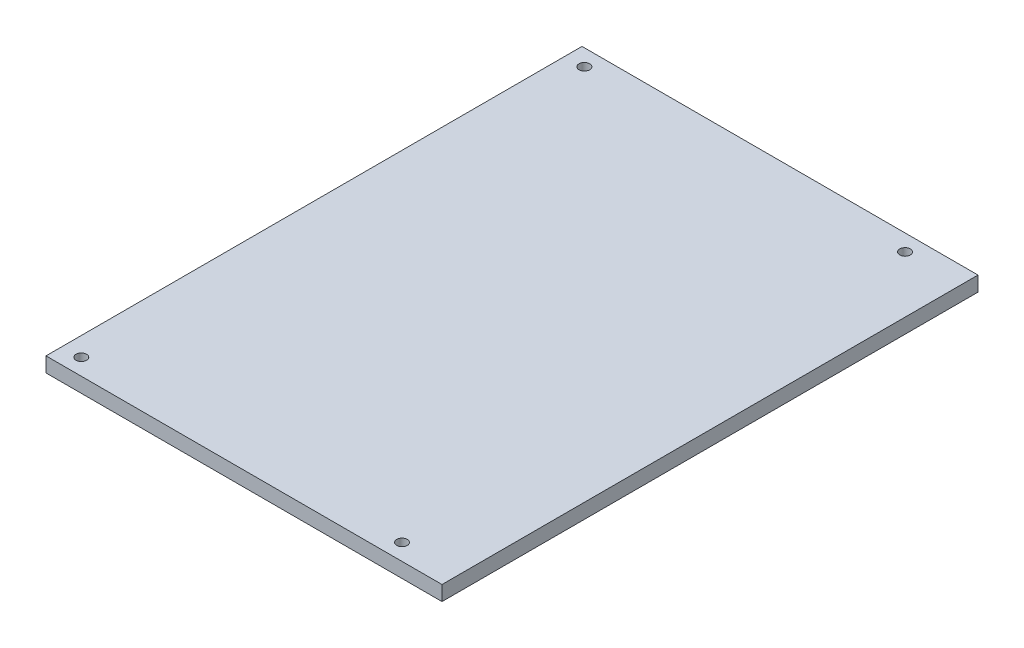
ISO-10303-21;
HEADER;
FILE_DESCRIPTION(('STEP AP214'),'2;1');
FILE_NAME('part.step','',(''),(''),'','','');
FILE_SCHEMA(('AUTOMOTIVE_DESIGN { 1 0 10303 214 1 1 1 1 }'));
ENDSEC;
DATA;
#1=APPLICATION_CONTEXT('core data for automotive mechanical design processes');
#2=APPLICATION_PROTOCOL_DEFINITION('international standard','automotive_design',2000,#1);
#3=PRODUCT_CONTEXT('',#1,'mechanical');
#4=PRODUCT('Part','Part','',(#3));
#5=PRODUCT_RELATED_PRODUCT_CATEGORY('part','',(#4));
#6=PRODUCT_DEFINITION_FORMATION('','',#4);
#7=PRODUCT_DEFINITION_CONTEXT('part definition',#1,'design');
#8=PRODUCT_DEFINITION('design','',#6,#7);
#9=PRODUCT_DEFINITION_SHAPE('','',#8);
#10=(LENGTH_UNIT() NAMED_UNIT(*) SI_UNIT(.MILLI.,.METRE.));
#11=(NAMED_UNIT(*) PLANE_ANGLE_UNIT() SI_UNIT($,.RADIAN.));
#12=(NAMED_UNIT(*) SI_UNIT($,.STERADIAN.) SOLID_ANGLE_UNIT());
#13=UNCERTAINTY_MEASURE_WITH_UNIT(LENGTH_MEASURE(1.E-05),#10,'distance_accuracy_value','');
#14=(GEOMETRIC_REPRESENTATION_CONTEXT(3) GLOBAL_UNCERTAINTY_ASSIGNED_CONTEXT((#13)) GLOBAL_UNIT_ASSIGNED_CONTEXT((#10,
#11,#12)) REPRESENTATION_CONTEXT('',''));
#15=CARTESIAN_POINT('',(0.,0.,0.));
#16=DIRECTION('',(0.,0.,1.));
#17=DIRECTION('',(1.,0.,0.));
#18=AXIS2_PLACEMENT_3D('',#15,#16,#17);
#19=CARTESIAN_POINT('',(0.,10.,0.));
#20=DIRECTION('',(0.,1.,0.));
#21=DIRECTION('',(0.,0.,1.));
#22=AXIS2_PLACEMENT_3D('',#19,#20,#21);
#23=PLANE('',#22);
#24=CARTESIAN_POINT('',(89.5613197969541,10.,-154.779225888325));
#25=DIRECTION('',(0.,1.,0.));
#26=DIRECTION('',(0.,0.,1.));
#27=AXIS2_PLACEMENT_3D('',#24,#25,#26);
#28=CIRCLE('',#27,3.57);
#29=CARTESIAN_POINT('',(89.5613197969541,10.,-151.209225888325));
#30=VERTEX_POINT('',#29);
#31=EDGE_CURVE('E121',#30,#30,#28,.T.);
#32=ORIENTED_EDGE('',*,*,#31,.F.);
#33=EDGE_LOOP('',(#32));
#34=FACE_BOUND('',#33,.T.);
#35=CARTESIAN_POINT('',(-126.858680203046,10.,184.675774111675));
#36=DIRECTION('',(0.,1.,0.));
#37=DIRECTION('',(0.,0.,1.));
#38=AXIS2_PLACEMENT_3D('',#35,#36,#37);
#39=CIRCLE('',#38,3.57);
#40=CARTESIAN_POINT('',(-126.858680203046,10.,188.245774111675));
#41=VERTEX_POINT('',#40);
#42=EDGE_CURVE('E100',#41,#41,#39,.T.);
#43=ORIENTED_EDGE('',*,*,#42,.F.);
#44=EDGE_LOOP('',(#43));
#45=FACE_BOUND('',#44,.T.);
#46=DIRECTION('',(0.,0.,1.));
#47=VECTOR('',#46,1.);
#48=CARTESIAN_POINT('',(-139.558680203046,10.,-165.891725888325));
#49=LINE('',#48,#47);
#50=CARTESIAN_POINT('',(-139.558680203046,10.,-165.891725888325));
#51=VERTEX_POINT('',#50);
#52=CARTESIAN_POINT('',(-139.558680203046,10.,195.788274111675));
#53=VERTEX_POINT('',#52);
#54=EDGE_CURVE('E85',#51,#53,#49,.T.);
#55=ORIENTED_EDGE('',*,*,#54,.T.);
#56=DIRECTION('',(1.,0.,0.));
#57=VECTOR('',#56,1.);
#58=CARTESIAN_POINT('',(-139.558680203046,10.,195.788274111675));
#59=LINE('',#58,#57);
#60=CARTESIAN_POINT('',(127.661319796954,10.,195.788274111675));
#61=VERTEX_POINT('',#60);
#62=EDGE_CURVE('E80',#53,#61,#59,.T.);
#63=ORIENTED_EDGE('',*,*,#62,.T.);
#64=DIRECTION('',(0.,0.,-1.));
#65=VECTOR('',#64,1.);
#66=CARTESIAN_POINT('',(127.661319796954,10.,-165.891725888325));
#67=LINE('',#66,#65);
#68=CARTESIAN_POINT('',(127.661319796954,10.,-165.891725888325));
#69=VERTEX_POINT('',#68);
#70=EDGE_CURVE('E83',#61,#69,#67,.T.);
#71=ORIENTED_EDGE('',*,*,#70,.T.);
#72=DIRECTION('',(-1.,0.,0.));
#73=VECTOR('',#72,1.);
#74=CARTESIAN_POINT('',(-139.558680203046,10.,-165.891725888325));
#75=LINE('',#74,#73);
#76=EDGE_CURVE('E50',#69,#51,#75,.T.);
#77=ORIENTED_EDGE('',*,*,#76,.T.);
#78=EDGE_LOOP('',(#55,#63,#71,#77));
#79=FACE_BOUND('',#78,.T.);
#80=CARTESIAN_POINT('',(-126.858680203046,10.,-154.779225888325));
#81=DIRECTION('',(0.,1.,0.));
#82=DIRECTION('',(0.,0.,1.));
#83=AXIS2_PLACEMENT_3D('',#80,#81,#82);
#84=CIRCLE('',#83,3.57);
#85=CARTESIAN_POINT('',(-126.858680203046,10.,-151.209225888325));
#86=VERTEX_POINT('',#85);
#87=EDGE_CURVE('E115',#86,#86,#84,.T.);
#88=ORIENTED_EDGE('',*,*,#87,.F.);
#89=EDGE_LOOP('',(#88));
#90=FACE_BOUND('',#89,.T.);
#91=CARTESIAN_POINT('',(89.5613197969541,10.,184.675774111675));
#92=DIRECTION('',(0.,1.,0.));
#93=DIRECTION('',(0.,0.,1.));
#94=AXIS2_PLACEMENT_3D('',#91,#92,#93);
#95=CIRCLE('',#94,3.57);
#96=CARTESIAN_POINT('',(89.5613197969541,10.,188.245774111675));
#97=VERTEX_POINT('',#96);
#98=EDGE_CURVE('E127',#97,#97,#95,.T.);
#99=ORIENTED_EDGE('',*,*,#98,.F.);
#100=EDGE_LOOP('',(#99));
#101=FACE_BOUND('',#100,.T.);
#102=ADVANCED_FACE('F33',(#34,#45,#79,#90,#101),#23,.T.);
#103=CARTESIAN_POINT('',(0.,0.,0.));
#104=DIRECTION('',(0.,1.,0.));
#105=DIRECTION('',(0.,0.,1.));
#106=AXIS2_PLACEMENT_3D('',#103,#104,#105);
#107=PLANE('',#106);
#108=CARTESIAN_POINT('',(89.5613197969541,0.,-154.779225888325));
#109=DIRECTION('',(0.,1.,0.));
#110=DIRECTION('',(0.,0.,1.));
#111=AXIS2_PLACEMENT_3D('',#108,#109,#110);
#112=CIRCLE('',#111,3.57);
#113=CARTESIAN_POINT('',(89.5613197969541,0.,-151.209225888325));
#114=VERTEX_POINT('',#113);
#115=EDGE_CURVE('E124',#114,#114,#112,.T.);
#116=ORIENTED_EDGE('',*,*,#115,.T.);
#117=EDGE_LOOP('',(#116));
#118=FACE_BOUND('',#117,.T.);
#119=CARTESIAN_POINT('',(-126.858680203046,0.,184.675774111675));
#120=DIRECTION('',(0.,1.,0.));
#121=DIRECTION('',(0.,0.,1.));
#122=AXIS2_PLACEMENT_3D('',#119,#120,#121);
#123=CIRCLE('',#122,3.57);
#124=CARTESIAN_POINT('',(-126.858680203046,0.,188.245774111675));
#125=VERTEX_POINT('',#124);
#126=EDGE_CURVE('E112',#125,#125,#123,.T.);
#127=ORIENTED_EDGE('',*,*,#126,.T.);
#128=EDGE_LOOP('',(#127));
#129=FACE_BOUND('',#128,.T.);
#130=DIRECTION('',(0.,0.,1.));
#131=VECTOR('',#130,1.);
#132=CARTESIAN_POINT('',(-139.558680203046,0.,-165.891725888325));
#133=LINE('',#132,#131);
#134=CARTESIAN_POINT('',(-139.558680203046,0.,-165.891725888325));
#135=VERTEX_POINT('',#134);
#136=CARTESIAN_POINT('',(-139.558680203046,0.,195.788274111675));
#137=VERTEX_POINT('',#136);
#138=EDGE_CURVE('E97',#135,#137,#133,.T.);
#139=ORIENTED_EDGE('',*,*,#138,.F.);
#140=DIRECTION('',(-1.,0.,0.));
#141=VECTOR('',#140,1.);
#142=CARTESIAN_POINT('',(-139.558680203046,0.,-165.891725888325));
#143=LINE('',#142,#141);
#144=CARTESIAN_POINT('',(127.661319796954,0.,-165.891725888325));
#145=VERTEX_POINT('',#144);
#146=EDGE_CURVE('E73',#145,#135,#143,.T.);
#147=ORIENTED_EDGE('',*,*,#146,.F.);
#148=DIRECTION('',(0.,0.,-1.));
#149=VECTOR('',#148,1.);
#150=CARTESIAN_POINT('',(127.661319796954,0.,-165.891725888325));
#151=LINE('',#150,#149);
#152=CARTESIAN_POINT('',(127.661319796954,0.,195.788274111675));
#153=VERTEX_POINT('',#152);
#154=EDGE_CURVE('E67',#153,#145,#151,.T.);
#155=ORIENTED_EDGE('',*,*,#154,.F.);
#156=DIRECTION('',(1.,0.,0.));
#157=VECTOR('',#156,1.);
#158=CARTESIAN_POINT('',(-139.558680203046,0.,195.788274111675));
#159=LINE('',#158,#157);
#160=EDGE_CURVE('E89',#137,#153,#159,.T.);
#161=ORIENTED_EDGE('',*,*,#160,.F.);
#162=EDGE_LOOP('',(#139,#147,#155,#161));
#163=FACE_BOUND('',#162,.T.);
#164=CARTESIAN_POINT('',(-126.858680203046,0.,-154.779225888325));
#165=DIRECTION('',(0.,1.,0.));
#166=DIRECTION('',(0.,0.,1.));
#167=AXIS2_PLACEMENT_3D('',#164,#165,#166);
#168=CIRCLE('',#167,3.57);
#169=CARTESIAN_POINT('',(-126.858680203046,0.,-151.209225888325));
#170=VERTEX_POINT('',#169);
#171=EDGE_CURVE('E118',#170,#170,#168,.T.);
#172=ORIENTED_EDGE('',*,*,#171,.T.);
#173=EDGE_LOOP('',(#172));
#174=FACE_BOUND('',#173,.T.);
#175=CARTESIAN_POINT('',(89.5613197969541,0.,184.675774111675));
#176=DIRECTION('',(0.,1.,0.));
#177=DIRECTION('',(0.,0.,1.));
#178=AXIS2_PLACEMENT_3D('',#175,#176,#177);
#179=CIRCLE('',#178,3.57);
#180=CARTESIAN_POINT('',(89.5613197969541,0.,188.245774111675));
#181=VERTEX_POINT('',#180);
#182=EDGE_CURVE('E130',#181,#181,#179,.T.);
#183=ORIENTED_EDGE('',*,*,#182,.T.);
#184=EDGE_LOOP('',(#183));
#185=FACE_BOUND('',#184,.T.);
#186=ADVANCED_FACE('F108',(#118,#129,#163,#174,#185),#107,.F.);
#187=CARTESIAN_POINT('',(-139.558680203046,10.,-165.891725888325));
#188=DIRECTION('',(1.,0.,0.));
#189=DIRECTION('',(0.,0.,-1.));
#190=AXIS2_PLACEMENT_3D('',#187,#188,#189);
#191=PLANE('',#190);
#192=ORIENTED_EDGE('',*,*,#138,.T.);
#193=DIRECTION('',(0.,-1.,0.));
#194=VECTOR('',#193,1.);
#195=CARTESIAN_POINT('',(-139.558680203046,10.,195.788274111675));
#196=LINE('',#195,#194);
#197=EDGE_CURVE('E11',#53,#137,#196,.T.);
#198=ORIENTED_EDGE('',*,*,#197,.F.);
#199=ORIENTED_EDGE('',*,*,#54,.F.);
#200=DIRECTION('',(0.,-1.,0.));
#201=VECTOR('',#200,1.);
#202=CARTESIAN_POINT('',(-139.558680203046,10.,-165.891725888325));
#203=LINE('',#202,#201);
#204=EDGE_CURVE('E93',#51,#135,#203,.T.);
#205=ORIENTED_EDGE('',*,*,#204,.T.);
#206=EDGE_LOOP('',(#192,#198,#199,#205));
#207=FACE_BOUND('',#206,.T.);
#208=ADVANCED_FACE('F35',(#207),#191,.F.);
#209=CARTESIAN_POINT('',(-139.558680203046,10.,195.788274111675));
#210=DIRECTION('',(0.,0.,-1.));
#211=DIRECTION('',(-1.,0.,0.));
#212=AXIS2_PLACEMENT_3D('',#209,#210,#211);
#213=PLANE('',#212);
#214=ORIENTED_EDGE('',*,*,#160,.T.);
#215=DIRECTION('',(0.,-1.,0.));
#216=VECTOR('',#215,1.);
#217=CARTESIAN_POINT('',(127.661319796954,10.,195.788274111675));
#218=LINE('',#217,#216);
#219=EDGE_CURVE('E42',#61,#153,#218,.T.);
#220=ORIENTED_EDGE('',*,*,#219,.F.);
#221=ORIENTED_EDGE('',*,*,#62,.F.);
#222=ORIENTED_EDGE('',*,*,#197,.T.);
#223=EDGE_LOOP('',(#214,#220,#221,#222));
#224=FACE_BOUND('',#223,.T.);
#225=ADVANCED_FACE('F88',(#224),#213,.F.);
#226=CARTESIAN_POINT('',(127.661319796954,10.,-165.891725888325));
#227=DIRECTION('',(-1.,0.,0.));
#228=DIRECTION('',(0.,0.,1.));
#229=AXIS2_PLACEMENT_3D('',#226,#227,#228);
#230=PLANE('',#229);
#231=ORIENTED_EDGE('',*,*,#154,.T.);
#232=DIRECTION('',(0.,-1.,0.));
#233=VECTOR('',#232,1.);
#234=CARTESIAN_POINT('',(127.661319796954,10.,-165.891725888325));
#235=LINE('',#234,#233);
#236=EDGE_CURVE('E90',#69,#145,#235,.T.);
#237=ORIENTED_EDGE('',*,*,#236,.F.);
#238=ORIENTED_EDGE('',*,*,#70,.F.);
#239=ORIENTED_EDGE('',*,*,#219,.T.);
#240=EDGE_LOOP('',(#231,#237,#238,#239));
#241=FACE_BOUND('',#240,.T.);
#242=ADVANCED_FACE('F91',(#241),#230,.F.);
#243=CARTESIAN_POINT('',(-139.558680203046,10.,-165.891725888325));
#244=DIRECTION('',(0.,0.,1.));
#245=DIRECTION('',(1.,0.,0.));
#246=AXIS2_PLACEMENT_3D('',#243,#244,#245);
#247=PLANE('',#246);
#248=ORIENTED_EDGE('',*,*,#146,.T.);
#249=ORIENTED_EDGE('',*,*,#204,.F.);
#250=ORIENTED_EDGE('',*,*,#76,.F.);
#251=ORIENTED_EDGE('',*,*,#236,.T.);
#252=EDGE_LOOP('',(#248,#249,#250,#251));
#253=FACE_BOUND('',#252,.T.);
#254=ADVANCED_FACE('F105',(#253),#247,.F.);
#255=CARTESIAN_POINT('',(-126.858680203046,10.,184.675774111675));
#256=DIRECTION('',(0.,-1.,0.));
#257=DIRECTION('',(0.,0.,-1.));
#258=AXIS2_PLACEMENT_3D('',#255,#256,#257);
#259=CYLINDRICAL_SURFACE('',#258,3.57);
#260=ORIENTED_EDGE('',*,*,#42,.T.);
#261=EDGE_LOOP('',(#260));
#262=FACE_BOUND('',#261,.T.);
#263=ORIENTED_EDGE('',*,*,#126,.F.);
#264=EDGE_LOOP('',(#263));
#265=FACE_BOUND('',#264,.T.);
#266=ADVANCED_FACE('F150',(#262,#265),#259,.F.);
#267=CARTESIAN_POINT('',(-126.858680203046,10.,-154.779225888325));
#268=DIRECTION('',(0.,-1.,0.));
#269=DIRECTION('',(0.,0.,-1.));
#270=AXIS2_PLACEMENT_3D('',#267,#268,#269);
#271=CYLINDRICAL_SURFACE('',#270,3.57);
#272=ORIENTED_EDGE('',*,*,#87,.T.);
#273=EDGE_LOOP('',(#272));
#274=FACE_BOUND('',#273,.T.);
#275=ORIENTED_EDGE('',*,*,#171,.F.);
#276=EDGE_LOOP('',(#275));
#277=FACE_BOUND('',#276,.T.);
#278=ADVANCED_FACE('F196',(#274,#277),#271,.F.);
#279=CARTESIAN_POINT('',(89.5613197969541,10.,-154.779225888325));
#280=DIRECTION('',(0.,-1.,0.));
#281=DIRECTION('',(0.,0.,-1.));
#282=AXIS2_PLACEMENT_3D('',#279,#280,#281);
#283=CYLINDRICAL_SURFACE('',#282,3.57);
#284=ORIENTED_EDGE('',*,*,#31,.T.);
#285=EDGE_LOOP('',(#284));
#286=FACE_BOUND('',#285,.T.);
#287=ORIENTED_EDGE('',*,*,#115,.F.);
#288=EDGE_LOOP('',(#287));
#289=FACE_BOUND('',#288,.T.);
#290=ADVANCED_FACE('F204',(#286,#289),#283,.F.);
#291=CARTESIAN_POINT('',(89.5613197969541,10.,184.675774111675));
#292=DIRECTION('',(0.,-1.,0.));
#293=DIRECTION('',(0.,0.,-1.));
#294=AXIS2_PLACEMENT_3D('',#291,#292,#293);
#295=CYLINDRICAL_SURFACE('',#294,3.57);
#296=ORIENTED_EDGE('',*,*,#98,.T.);
#297=EDGE_LOOP('',(#296));
#298=FACE_BOUND('',#297,.T.);
#299=ORIENTED_EDGE('',*,*,#182,.F.);
#300=EDGE_LOOP('',(#299));
#301=FACE_BOUND('',#300,.T.);
#302=ADVANCED_FACE('F136',(#298,#301),#295,.F.);
#303=CLOSED_SHELL('',(#102,#186,#208,#225,#242,#254,#266,#278,#290,#302));
#304=MANIFOLD_SOLID_BREP('B2',#303);
#305=ADVANCED_BREP_SHAPE_REPRESENTATION('',(#18,#304),#14);
#306=SHAPE_DEFINITION_REPRESENTATION(#9,#305);
ENDSEC;
END-ISO-10303-21;
